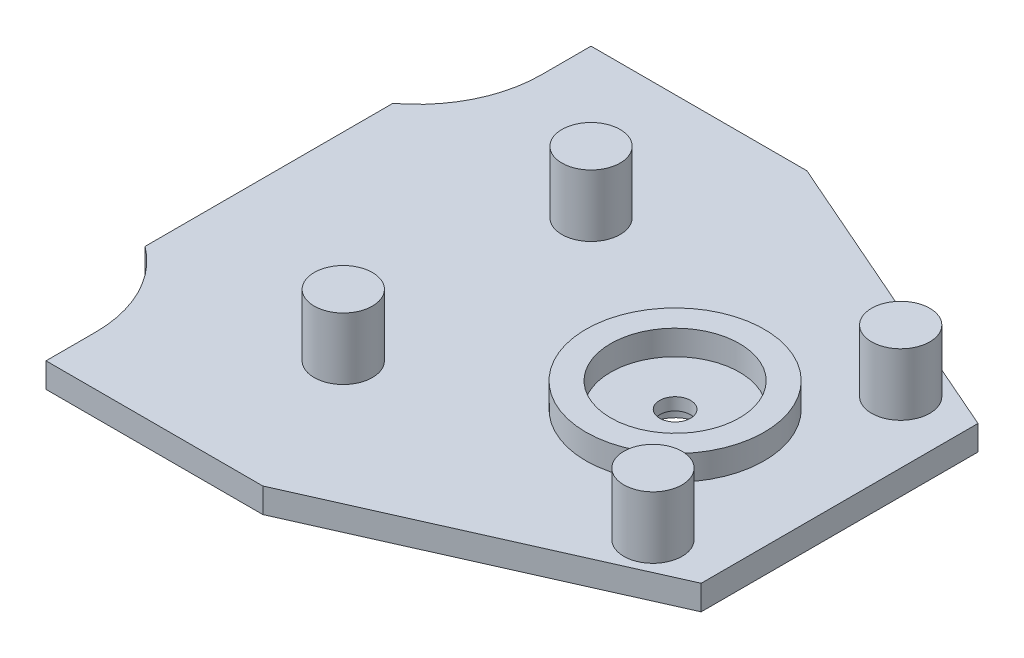
ISO-10303-21;
HEADER;
FILE_DESCRIPTION(('STEP AP214'),'2;1');
FILE_NAME('part.step','',(''),(''),'','','');
FILE_SCHEMA(('AUTOMOTIVE_DESIGN { 1 0 10303 214 1 1 1 1 }'));
ENDSEC;
DATA;
#1=APPLICATION_CONTEXT('core data for automotive mechanical design processes');
#2=APPLICATION_PROTOCOL_DEFINITION('international standard','automotive_design',2000,#1);
#3=PRODUCT_CONTEXT('',#1,'mechanical');
#4=PRODUCT('Part','Part','',(#3));
#5=PRODUCT_RELATED_PRODUCT_CATEGORY('part','',(#4));
#6=PRODUCT_DEFINITION_FORMATION('','',#4);
#7=PRODUCT_DEFINITION_CONTEXT('part definition',#1,'design');
#8=PRODUCT_DEFINITION('design','',#6,#7);
#9=PRODUCT_DEFINITION_SHAPE('','',#8);
#10=(LENGTH_UNIT() NAMED_UNIT(*) SI_UNIT(.MILLI.,.METRE.));
#11=(NAMED_UNIT(*) PLANE_ANGLE_UNIT() SI_UNIT($,.RADIAN.));
#12=(NAMED_UNIT(*) SI_UNIT($,.STERADIAN.) SOLID_ANGLE_UNIT());
#13=UNCERTAINTY_MEASURE_WITH_UNIT(LENGTH_MEASURE(1.E-05),#10,'distance_accuracy_value','');
#14=(GEOMETRIC_REPRESENTATION_CONTEXT(3) GLOBAL_UNCERTAINTY_ASSIGNED_CONTEXT((#13)) GLOBAL_UNIT_ASSIGNED_CONTEXT((#10,
#11,#12)) REPRESENTATION_CONTEXT('',''));
#15=CARTESIAN_POINT('',(0.,0.,0.));
#16=DIRECTION('',(0.,0.,1.));
#17=DIRECTION('',(1.,0.,0.));
#18=AXIS2_PLACEMENT_3D('',#15,#16,#17);
#19=CARTESIAN_POINT('',(11.5684631121391,2.,-2.08513458074343));
#20=DIRECTION('',(0.,-1.,0.));
#21=DIRECTION('',(0.,0.,-1.));
#22=AXIS2_PLACEMENT_3D('',#19,#20,#21);
#23=CYLINDRICAL_SURFACE('',#22,1.25);
#24=CARTESIAN_POINT('',(11.5684631121391,2.,-2.08513458074343));
#25=DIRECTION('',(0.,-1.,0.));
#26=DIRECTION('',(0.,0.,-1.));
#27=AXIS2_PLACEMENT_3D('',#24,#25,#26);
#28=CIRCLE('',#27,1.25);
#29=CARTESIAN_POINT('',(11.5684631121391,2.,-3.33513458074343));
#30=VERTEX_POINT('',#29);
#31=EDGE_CURVE('E496',#30,#30,#28,.T.);
#32=ORIENTED_EDGE('',*,*,#31,.F.);
#33=EDGE_LOOP('',(#32));
#34=FACE_BOUND('',#33,.T.);
#35=CARTESIAN_POINT('',(11.5684631121391,1.,-2.08513458074343));
#36=DIRECTION('',(0.,-1.,0.));
#37=DIRECTION('',(0.,0.,-1.));
#38=AXIS2_PLACEMENT_3D('',#35,#36,#37);
#39=CIRCLE('',#38,1.25);
#40=CARTESIAN_POINT('',(11.5684631121391,1.,-3.33513458074343));
#41=VERTEX_POINT('',#40);
#42=EDGE_CURVE('E41',#41,#41,#39,.F.);
#43=ORIENTED_EDGE('',*,*,#42,.F.);
#44=EDGE_LOOP('',(#43));
#45=FACE_BOUND('',#44,.T.);
#46=ADVANCED_FACE('F37',(#34,#45),#23,.F.);
#47=CARTESIAN_POINT('',(0.,2.,19.9148654192566));
#48=DIRECTION('',(0.,0.,-1.));
#49=DIRECTION('',(-1.,0.,0.));
#50=AXIS2_PLACEMENT_3D('',#47,#48,#49);
#51=PLANE('',#50);
#52=DIRECTION('',(1.,0.,0.));
#53=VECTOR('',#52,1.);
#54=CARTESIAN_POINT('',(0.,0.,19.9148654192566));
#55=LINE('',#54,#53);
#56=CARTESIAN_POINT('',(-17.2192882245591,0.,19.9148654192566));
#57=VERTEX_POINT('',#56);
#58=CARTESIAN_POINT('',(0.28632975296894,0.,19.9148654192566));
#59=VERTEX_POINT('',#58);
#60=EDGE_CURVE('E142',#57,#59,#55,.T.);
#61=ORIENTED_EDGE('',*,*,#60,.T.);
#62=DIRECTION('',(0.,-1.,0.));
#63=VECTOR('',#62,1.);
#64=CARTESIAN_POINT('',(0.28632975296894,2.,19.9148654192566));
#65=LINE('',#64,#63);
#66=CARTESIAN_POINT('',(0.28632975296894,2.,19.9148654192566));
#67=VERTEX_POINT('',#66);
#68=EDGE_CURVE('E122',#67,#59,#65,.T.);
#69=ORIENTED_EDGE('',*,*,#68,.F.);
#70=DIRECTION('',(1.,0.,0.));
#71=VECTOR('',#70,1.);
#72=CARTESIAN_POINT('',(0.,2.,19.9148654192566));
#73=LINE('',#72,#71);
#74=CARTESIAN_POINT('',(-17.2192882245591,2.,19.9148654192566));
#75=VERTEX_POINT('',#74);
#76=EDGE_CURVE('E129',#75,#67,#73,.T.);
#77=ORIENTED_EDGE('',*,*,#76,.F.);
#78=DIRECTION('',(0.,-1.,0.));
#79=VECTOR('',#78,1.);
#80=CARTESIAN_POINT('',(-17.2192882245591,2.,19.9148654192566));
#81=LINE('',#80,#79);
#82=EDGE_CURVE('E178',#75,#57,#81,.T.);
#83=ORIENTED_EDGE('',*,*,#82,.T.);
#84=EDGE_LOOP('',(#61,#69,#77,#83));
#85=FACE_BOUND('',#84,.T.);
#86=ADVANCED_FACE('F140',(#85),#51,.F.);
#87=CARTESIAN_POINT('',(7.44047295639382,2.,16.7338814208282));
#88=DIRECTION('',(-0.406284023423672,0.,-0.913746842572205));
#89=DIRECTION('',(-0.913746842572205,0.,0.406284023423672));
#90=AXIS2_PLACEMENT_3D('',#87,#88,#89);
#91=PLANE('',#90);
#92=DIRECTION('',(0.913746842572205,0.,-0.406284023423672));
#93=VECTOR('',#92,1.);
#94=CARTESIAN_POINT('',(7.44047295639382,0.,16.7338814208282));
#95=LINE('',#94,#93);
#96=CARTESIAN_POINT('',(24.780711775441,0.,9.02380061256203));
#97=VERTEX_POINT('',#96);
#98=EDGE_CURVE('E199',#59,#97,#95,.T.);
#99=ORIENTED_EDGE('',*,*,#98,.T.);
#100=DIRECTION('',(0.,-1.,0.));
#101=VECTOR('',#100,1.);
#102=CARTESIAN_POINT('',(24.780711775441,2.,9.02380061256203));
#103=LINE('',#102,#101);
#104=CARTESIAN_POINT('',(24.780711775441,2.,9.02380061256203));
#105=VERTEX_POINT('',#104);
#106=EDGE_CURVE('E124',#105,#97,#103,.T.);
#107=ORIENTED_EDGE('',*,*,#106,.F.);
#108=DIRECTION('',(0.913746842572205,0.,-0.406284023423672));
#109=VECTOR('',#108,1.);
#110=CARTESIAN_POINT('',(7.44047295639382,2.,16.7338814208282));
#111=LINE('',#110,#109);
#112=EDGE_CURVE('E117',#67,#105,#111,.T.);
#113=ORIENTED_EDGE('',*,*,#112,.F.);
#114=ORIENTED_EDGE('',*,*,#68,.T.);
#115=EDGE_LOOP('',(#99,#107,#113,#114));
#116=FACE_BOUND('',#115,.T.);
#117=ADVANCED_FACE('F120',(#116),#91,.F.);
#118=CARTESIAN_POINT('',(24.780711775441,2.,0.));
#119=DIRECTION('',(1.,0.,0.));
#120=DIRECTION('',(0.,0.,-1.));
#121=AXIS2_PLACEMENT_3D('',#118,#119,#120);
#122=PLANE('',#121);
#123=DIRECTION('',(0.,0.,1.));
#124=VECTOR('',#123,1.);
#125=CARTESIAN_POINT('',(24.780711775441,0.,0.));
#126=LINE('',#125,#124);
#127=CARTESIAN_POINT('',(24.780711775441,0.,-13.3261993874363));
#128=VERTEX_POINT('',#127);
#129=EDGE_CURVE('E195',#128,#97,#126,.T.);
#130=ORIENTED_EDGE('',*,*,#129,.F.);
#131=DIRECTION('',(0.,-1.,0.));
#132=VECTOR('',#131,1.);
#133=CARTESIAN_POINT('',(24.780711775441,2.,-13.3261993874363));
#134=LINE('',#133,#132);
#135=CARTESIAN_POINT('',(24.780711775441,2.,-13.3261993874363));
#136=VERTEX_POINT('',#135);
#137=EDGE_CURVE('E147',#136,#128,#134,.T.);
#138=ORIENTED_EDGE('',*,*,#137,.F.);
#139=DIRECTION('',(0.,0.,1.));
#140=VECTOR('',#139,1.);
#141=CARTESIAN_POINT('',(24.780711775441,2.,0.));
#142=LINE('',#141,#140);
#143=EDGE_CURVE('E128',#136,#105,#142,.T.);
#144=ORIENTED_EDGE('',*,*,#143,.T.);
#145=ORIENTED_EDGE('',*,*,#106,.T.);
#146=EDGE_LOOP('',(#130,#138,#144,#145));
#147=FACE_BOUND('',#146,.T.);
#148=ADVANCED_FACE('F198',(#147),#122,.T.);
#149=CARTESIAN_POINT('',(8.88303366933993,2.,-20.287214615769));
#150=DIRECTION('',(-0.401098407988486,0.,0.916034970461883));
#151=DIRECTION('',(0.916034970461883,0.,0.401098407988486));
#152=AXIS2_PLACEMENT_3D('',#149,#150,#151);
#153=PLANE('',#152);
#154=DIRECTION('',(-0.916034970461883,0.,-0.401098407988486));
#155=VECTOR('',#154,1.);
#156=CARTESIAN_POINT('',(8.88303366933993,0.,-20.287214615769));
#157=LINE('',#156,#155);
#158=CARTESIAN_POINT('',(0.209283204013273,0.,-24.0851345807434));
#159=VERTEX_POINT('',#158);
#160=EDGE_CURVE('E188',#128,#159,#157,.T.);
#161=ORIENTED_EDGE('',*,*,#160,.T.);
#162=DIRECTION('',(0.,-1.,0.));
#163=VECTOR('',#162,1.);
#164=CARTESIAN_POINT('',(0.209283204013273,2.,-24.0851345807434));
#165=LINE('',#164,#163);
#166=CARTESIAN_POINT('',(0.209283204013273,2.,-24.0851345807434));
#167=VERTEX_POINT('',#166);
#168=EDGE_CURVE('E176',#167,#159,#165,.T.);
#169=ORIENTED_EDGE('',*,*,#168,.F.);
#170=DIRECTION('',(-0.916034970461883,0.,-0.401098407988486));
#171=VECTOR('',#170,1.);
#172=CARTESIAN_POINT('',(8.88303366933993,2.,-20.287214615769));
#173=LINE('',#172,#171);
#174=EDGE_CURVE('E189',#136,#167,#173,.T.);
#175=ORIENTED_EDGE('',*,*,#174,.F.);
#176=ORIENTED_EDGE('',*,*,#137,.T.);
#177=EDGE_LOOP('',(#161,#169,#175,#176));
#178=FACE_BOUND('',#177,.T.);
#179=ADVANCED_FACE('F186',(#178),#153,.F.);
#180=CARTESIAN_POINT('',(0.,2.,-24.0851345807434));
#181=DIRECTION('',(0.,0.,1.));
#182=DIRECTION('',(1.,0.,0.));
#183=AXIS2_PLACEMENT_3D('',#180,#181,#182);
#184=PLANE('',#183);
#185=DIRECTION('',(-1.,0.,0.));
#186=VECTOR('',#185,1.);
#187=CARTESIAN_POINT('',(0.,0.,-24.0851345807434));
#188=LINE('',#187,#186);
#189=CARTESIAN_POINT('',(-17.219288224559,0.,-24.0851345807435));
#190=VERTEX_POINT('',#189);
#191=EDGE_CURVE('E196',#159,#190,#188,.T.);
#192=ORIENTED_EDGE('',*,*,#191,.T.);
#193=DIRECTION('',(0.,-1.,0.));
#194=VECTOR('',#193,1.);
#195=CARTESIAN_POINT('',(-17.219288224559,2.,-24.0851345807435));
#196=LINE('',#195,#194);
#197=CARTESIAN_POINT('',(-17.219288224559,2.,-24.0851345807435));
#198=VERTEX_POINT('',#197);
#199=EDGE_CURVE('E173',#198,#190,#196,.T.);
#200=ORIENTED_EDGE('',*,*,#199,.F.);
#201=DIRECTION('',(-1.,0.,0.));
#202=VECTOR('',#201,1.);
#203=CARTESIAN_POINT('',(0.,2.,-24.0851345807434));
#204=LINE('',#203,#202);
#205=EDGE_CURVE('E225',#167,#198,#204,.T.);
#206=ORIENTED_EDGE('',*,*,#205,.F.);
#207=ORIENTED_EDGE('',*,*,#168,.T.);
#208=EDGE_LOOP('',(#192,#200,#206,#207));
#209=FACE_BOUND('',#208,.T.);
#210=ADVANCED_FACE('F229',(#209),#184,.F.);
#211=CARTESIAN_POINT('',(-17.2192882245591,2.,0.));
#212=DIRECTION('',(1.,0.,0.));
#213=DIRECTION('',(0.,0.,-1.));
#214=AXIS2_PLACEMENT_3D('',#211,#212,#213);
#215=PLANE('',#214);
#216=DIRECTION('',(0.,0.,1.));
#217=VECTOR('',#216,1.);
#218=CARTESIAN_POINT('',(-17.2192882245591,0.,0.));
#219=LINE('',#218,#217);
#220=CARTESIAN_POINT('',(-17.219288224559,0.,-20.0851345807434));
#221=VERTEX_POINT('',#220);
#222=EDGE_CURVE('E205',#190,#221,#219,.T.);
#223=ORIENTED_EDGE('',*,*,#222,.T.);
#224=DIRECTION('',(0.,1.,0.));
#225=VECTOR('',#224,1.);
#226=CARTESIAN_POINT('',(-17.219288224559,2.,-20.0851345807434));
#227=LINE('',#226,#225);
#228=CARTESIAN_POINT('',(-17.219288224559,2.,-20.0851345807434));
#229=VERTEX_POINT('',#228);
#230=EDGE_CURVE('E53',#221,#229,#227,.T.);
#231=ORIENTED_EDGE('',*,*,#230,.T.);
#232=DIRECTION('',(0.,0.,1.));
#233=VECTOR('',#232,1.);
#234=CARTESIAN_POINT('',(-17.2192882245591,2.,0.));
#235=LINE('',#234,#233);
#236=EDGE_CURVE('E161',#198,#229,#235,.T.);
#237=ORIENTED_EDGE('',*,*,#236,.F.);
#238=ORIENTED_EDGE('',*,*,#199,.T.);
#239=EDGE_LOOP('',(#223,#231,#237,#238));
#240=FACE_BOUND('',#239,.T.);
#241=ADVANCED_FACE('F230',(#240),#215,.F.);
#242=CARTESIAN_POINT('',(-21.219288224559,2.,0.));
#243=DIRECTION('',(1.,0.,0.));
#244=DIRECTION('',(0.,0.,-1.));
#245=AXIS2_PLACEMENT_3D('',#242,#243,#244);
#246=PLANE('',#245);
#247=DIRECTION('',(0.,0.,1.));
#248=VECTOR('',#247,1.);
#249=CARTESIAN_POINT('',(-21.219288224559,0.,0.));
#250=LINE('',#249,#248);
#251=CARTESIAN_POINT('',(-21.219288224559,0.,-12.0851345807434));
#252=VERTEX_POINT('',#251);
#253=CARTESIAN_POINT('',(-21.2192882245591,0.,7.91486541925655));
#254=VERTEX_POINT('',#253);
#255=EDGE_CURVE('E207',#252,#254,#250,.T.);
#256=ORIENTED_EDGE('',*,*,#255,.T.);
#257=DIRECTION('',(0.,-1.,0.));
#258=VECTOR('',#257,1.);
#259=CARTESIAN_POINT('',(-21.2192882245591,2.,7.91486541925655));
#260=LINE('',#259,#258);
#261=CARTESIAN_POINT('',(-21.2192882245591,2.,7.91486541925655));
#262=VERTEX_POINT('',#261);
#263=EDGE_CURVE('E170',#262,#254,#260,.T.);
#264=ORIENTED_EDGE('',*,*,#263,.F.);
#265=DIRECTION('',(0.,0.,1.));
#266=VECTOR('',#265,1.);
#267=CARTESIAN_POINT('',(-21.219288224559,2.,0.));
#268=LINE('',#267,#266);
#269=CARTESIAN_POINT('',(-21.219288224559,2.,-12.0851345807434));
#270=VERTEX_POINT('',#269);
#271=EDGE_CURVE('E159',#270,#262,#268,.T.);
#272=ORIENTED_EDGE('',*,*,#271,.F.);
#273=DIRECTION('',(0.,-1.,0.));
#274=VECTOR('',#273,1.);
#275=CARTESIAN_POINT('',(-21.219288224559,2.,-12.0851345807434));
#276=LINE('',#275,#274);
#277=EDGE_CURVE('E168',#270,#252,#276,.T.);
#278=ORIENTED_EDGE('',*,*,#277,.T.);
#279=EDGE_LOOP('',(#256,#264,#272,#278));
#280=FACE_BOUND('',#279,.T.);
#281=ADVANCED_FACE('F167',(#280),#246,.F.);
#282=CARTESIAN_POINT('',(-17.219288224559,2.,0.));
#283=DIRECTION('',(1.,0.,0.));
#284=DIRECTION('',(0.,0.,-1.));
#285=AXIS2_PLACEMENT_3D('',#282,#283,#284);
#286=PLANE('',#285);
#287=DIRECTION('',(0.,0.,1.));
#288=VECTOR('',#287,1.);
#289=CARTESIAN_POINT('',(-17.219288224559,2.,0.));
#290=LINE('',#289,#288);
#291=CARTESIAN_POINT('',(-17.2192882245591,2.,15.9148654192566));
#292=VERTEX_POINT('',#291);
#293=EDGE_CURVE('E134',#292,#75,#290,.T.);
#294=ORIENTED_EDGE('',*,*,#293,.F.);
#295=DIRECTION('',(0.,-1.,0.));
#296=VECTOR('',#295,1.);
#297=CARTESIAN_POINT('',(-17.2192882245591,2.,15.9148654192566));
#298=LINE('',#297,#296);
#299=CARTESIAN_POINT('',(-17.2192882245591,0.,15.9148654192566));
#300=VERTEX_POINT('',#299);
#301=EDGE_CURVE('E143',#292,#300,#298,.T.);
#302=ORIENTED_EDGE('',*,*,#301,.T.);
#303=DIRECTION('',(0.,0.,1.));
#304=VECTOR('',#303,1.);
#305=CARTESIAN_POINT('',(-17.219288224559,0.,0.));
#306=LINE('',#305,#304);
#307=EDGE_CURVE('E138',#300,#57,#306,.T.);
#308=ORIENTED_EDGE('',*,*,#307,.T.);
#309=ORIENTED_EDGE('',*,*,#82,.F.);
#310=EDGE_LOOP('',(#294,#302,#308,#309));
#311=FACE_BOUND('',#310,.T.);
#312=ADVANCED_FACE('F237',(#311),#286,.F.);
#313=CARTESIAN_POINT('',(0.,2.,0.));
#314=DIRECTION('',(0.,1.,0.));
#315=DIRECTION('',(0.,0.,1.));
#316=AXIS2_PLACEMENT_3D('',#313,#314,#315);
#317=PLANE('',#316);
#318=CARTESIAN_POINT('',(-5.21928822455917,2.,-12.0851345807436));
#319=DIRECTION('',(0.,1.,0.));
#320=DIRECTION('',(0.,0.,1.));
#321=AXIS2_PLACEMENT_3D('',#318,#319,#320);
#322=CIRCLE('',#321,2.35);
#323=CARTESIAN_POINT('',(-5.21928822455917,2.,-9.73513458074358));
#324=VERTEX_POINT('',#323);
#325=EDGE_CURVE('E469',#324,#324,#322,.T.);
#326=ORIENTED_EDGE('',*,*,#325,.F.);
#327=EDGE_LOOP('',(#326));
#328=FACE_BOUND('',#327,.T.);
#329=CARTESIAN_POINT('',(-5.21928822455906,2.,7.91486541925656));
#330=DIRECTION('',(0.,1.,0.));
#331=DIRECTION('',(0.,0.,1.));
#332=AXIS2_PLACEMENT_3D('',#329,#330,#331);
#333=CIRCLE('',#332,2.35);
#334=CARTESIAN_POINT('',(-5.21928822455906,2.,10.2648654192566));
#335=VERTEX_POINT('',#334);
#336=EDGE_CURVE('E468',#335,#335,#333,.T.);
#337=ORIENTED_EDGE('',*,*,#336,.F.);
#338=EDGE_LOOP('',(#337));
#339=FACE_BOUND('',#338,.T.);
#340=CARTESIAN_POINT('',(19.7807117754409,2.,-12.0851345807433));
#341=DIRECTION('',(0.,1.,0.));
#342=DIRECTION('',(0.,0.,1.));
#343=AXIS2_PLACEMENT_3D('',#340,#341,#342);
#344=CIRCLE('',#343,2.35000000000005);
#345=CARTESIAN_POINT('',(19.7807117754409,2.,-9.73513458074326));
#346=VERTEX_POINT('',#345);
#347=EDGE_CURVE('E478',#346,#346,#344,.T.);
#348=ORIENTED_EDGE('',*,*,#347,.F.);
#349=EDGE_LOOP('',(#348));
#350=FACE_BOUND('',#349,.T.);
#351=CARTESIAN_POINT('',(19.7807117754415,2.,7.91486541925547));
#352=DIRECTION('',(0.,1.,0.));
#353=DIRECTION('',(0.,0.,1.));
#354=AXIS2_PLACEMENT_3D('',#351,#352,#353);
#355=CIRCLE('',#354,2.34999999999959);
#356=CARTESIAN_POINT('',(19.7807117754415,2.,10.2648654192551));
#357=VERTEX_POINT('',#356);
#358=EDGE_CURVE('E483',#357,#357,#355,.T.);
#359=ORIENTED_EDGE('',*,*,#358,.F.);
#360=EDGE_LOOP('',(#359));
#361=FACE_BOUND('',#360,.T.);
#362=CARTESIAN_POINT('',(11.5684631121391,2.,-2.08513458074343));
#363=DIRECTION('',(0.,1.,0.));
#364=DIRECTION('',(0.,0.,1.));
#365=AXIS2_PLACEMENT_3D('',#362,#363,#364);
#366=CIRCLE('',#365,7.2);
#367=CARTESIAN_POINT('',(11.5684631121391,2.,5.11486541925656));
#368=VERTEX_POINT('',#367);
#369=EDGE_CURVE('E213',#368,#368,#366,.T.);
#370=ORIENTED_EDGE('',*,*,#369,.F.);
#371=EDGE_LOOP('',(#370));
#372=FACE_BOUND('',#371,.T.);
#373=ORIENTED_EDGE('',*,*,#76,.T.);
#374=ORIENTED_EDGE('',*,*,#112,.T.);
#375=ORIENTED_EDGE('',*,*,#143,.F.);
#376=ORIENTED_EDGE('',*,*,#174,.T.);
#377=ORIENTED_EDGE('',*,*,#205,.T.);
#378=ORIENTED_EDGE('',*,*,#236,.T.);
#379=CARTESIAN_POINT('',(-27.219288224559,2.,-20.0851345807434));
#380=DIRECTION('',(0.,1.,0.));
#381=DIRECTION('',(0.,0.,1.));
#382=AXIS2_PLACEMENT_3D('',#379,#380,#381);
#383=CIRCLE('',#382,10.);
#384=EDGE_CURVE('E46',#229,#270,#383,.F.);
#385=ORIENTED_EDGE('',*,*,#384,.T.);
#386=ORIENTED_EDGE('',*,*,#271,.T.);
#387=CARTESIAN_POINT('',(-27.2192882245591,2.,15.9148654192565));
#388=DIRECTION('',(0.,1.,0.));
#389=DIRECTION('',(0.,0.,1.));
#390=AXIS2_PLACEMENT_3D('',#387,#388,#389);
#391=CIRCLE('',#390,10.);
#392=EDGE_CURVE('E154',#262,#292,#391,.F.);
#393=ORIENTED_EDGE('',*,*,#392,.T.);
#394=ORIENTED_EDGE('',*,*,#293,.T.);
#395=EDGE_LOOP('',(#373,#374,#375,#376,#377,#378,#385,#386,#393,#394));
#396=FACE_BOUND('',#395,.T.);
#397=ADVANCED_FACE('F132',(#328,#339,#350,#361,#372,#396),#317,.T.);
#398=CARTESIAN_POINT('',(0.,0.,0.));
#399=DIRECTION('',(0.,1.,0.));
#400=DIRECTION('',(0.,0.,1.));
#401=AXIS2_PLACEMENT_3D('',#398,#399,#400);
#402=PLANE('',#401);
#403=CARTESIAN_POINT('',(11.5684631121391,0.,-2.08513458074343));
#404=DIRECTION('',(0.,-1.,0.));
#405=DIRECTION('',(0.,0.,-1.));
#406=AXIS2_PLACEMENT_3D('',#403,#404,#405);
#407=CIRCLE('',#406,2.);
#408=CARTESIAN_POINT('',(11.5684631121391,0.,-4.08513458074343));
#409=VERTEX_POINT('',#408);
#410=EDGE_CURVE('E489',#409,#409,#407,.T.);
#411=ORIENTED_EDGE('',*,*,#410,.F.);
#412=EDGE_LOOP('',(#411));
#413=FACE_BOUND('',#412,.T.);
#414=ORIENTED_EDGE('',*,*,#60,.F.);
#415=ORIENTED_EDGE('',*,*,#307,.F.);
#416=CARTESIAN_POINT('',(-27.2192882245591,0.,15.9148654192565));
#417=DIRECTION('',(0.,1.,0.));
#418=DIRECTION('',(0.,0.,1.));
#419=AXIS2_PLACEMENT_3D('',#416,#417,#418);
#420=CIRCLE('',#419,10.);
#421=EDGE_CURVE('E152',#300,#254,#420,.T.);
#422=ORIENTED_EDGE('',*,*,#421,.T.);
#423=ORIENTED_EDGE('',*,*,#255,.F.);
#424=CARTESIAN_POINT('',(-27.219288224559,0.,-20.0851345807434));
#425=DIRECTION('',(0.,1.,0.));
#426=DIRECTION('',(0.,0.,1.));
#427=AXIS2_PLACEMENT_3D('',#424,#425,#426);
#428=CIRCLE('',#427,10.);
#429=EDGE_CURVE('E61',#252,#221,#428,.T.);
#430=ORIENTED_EDGE('',*,*,#429,.T.);
#431=ORIENTED_EDGE('',*,*,#222,.F.);
#432=ORIENTED_EDGE('',*,*,#191,.F.);
#433=ORIENTED_EDGE('',*,*,#160,.F.);
#434=ORIENTED_EDGE('',*,*,#129,.T.);
#435=ORIENTED_EDGE('',*,*,#98,.F.);
#436=EDGE_LOOP('',(#414,#415,#422,#423,#430,#431,#432,#433,#434,#435));
#437=FACE_BOUND('',#436,.T.);
#438=ADVANCED_FACE('F194',(#413,#437),#402,.F.);
#439=CARTESIAN_POINT('',(-27.2192882245591,2.,15.9148654192565));
#440=DIRECTION('',(0.,-1.,0.));
#441=DIRECTION('',(0.,0.,-1.));
#442=AXIS2_PLACEMENT_3D('',#439,#440,#441);
#443=CYLINDRICAL_SURFACE('',#442,10.);
#444=ORIENTED_EDGE('',*,*,#392,.F.);
#445=ORIENTED_EDGE('',*,*,#263,.T.);
#446=ORIENTED_EDGE('',*,*,#421,.F.);
#447=ORIENTED_EDGE('',*,*,#301,.F.);
#448=EDGE_LOOP('',(#444,#445,#446,#447));
#449=FACE_BOUND('',#448,.T.);
#450=ADVANCED_FACE('F270',(#449),#443,.F.);
#451=CARTESIAN_POINT('',(-27.219288224559,2.,-20.0851345807434));
#452=DIRECTION('',(0.,1.,0.));
#453=DIRECTION('',(0.,0.,1.));
#454=AXIS2_PLACEMENT_3D('',#451,#452,#453);
#455=CYLINDRICAL_SURFACE('',#454,10.);
#456=ORIENTED_EDGE('',*,*,#384,.F.);
#457=ORIENTED_EDGE('',*,*,#230,.F.);
#458=ORIENTED_EDGE('',*,*,#429,.F.);
#459=ORIENTED_EDGE('',*,*,#277,.F.);
#460=EDGE_LOOP('',(#456,#457,#458,#459));
#461=FACE_BOUND('',#460,.T.);
#462=ADVANCED_FACE('F39',(#461),#455,.F.);
#463=CARTESIAN_POINT('',(11.5684631121391,4.,-2.08513458074343));
#464=DIRECTION('',(0.,1.,0.));
#465=DIRECTION('',(0.,0.,1.));
#466=AXIS2_PLACEMENT_3D('',#463,#464,#465);
#467=PLANE('',#466);
#468=CARTESIAN_POINT('',(11.5684631121391,4.,-2.08513458074343));
#469=DIRECTION('',(0.,1.,0.));
#470=DIRECTION('',(0.,0.,1.));
#471=AXIS2_PLACEMENT_3D('',#468,#469,#470);
#472=CIRCLE('',#471,7.2);
#473=CARTESIAN_POINT('',(11.5684631121391,4.,5.11486541925656));
#474=VERTEX_POINT('',#473);
#475=EDGE_CURVE('E211',#474,#474,#472,.T.);
#476=ORIENTED_EDGE('',*,*,#475,.T.);
#477=EDGE_LOOP('',(#476));
#478=FACE_BOUND('',#477,.T.);
#479=CARTESIAN_POINT('',(11.5684631121391,4.,-2.08513458074343));
#480=DIRECTION('',(0.,1.,0.));
#481=DIRECTION('',(0.,0.,1.));
#482=AXIS2_PLACEMENT_3D('',#479,#480,#481);
#483=CIRCLE('',#482,5.2);
#484=CARTESIAN_POINT('',(11.5684631121391,4.,3.11486541925657));
#485=VERTEX_POINT('',#484);
#486=EDGE_CURVE('E218',#485,#485,#483,.T.);
#487=ORIENTED_EDGE('',*,*,#486,.F.);
#488=EDGE_LOOP('',(#487));
#489=FACE_BOUND('',#488,.T.);
#490=ADVANCED_FACE('F259',(#478,#489),#467,.T.);
#491=CARTESIAN_POINT('',(11.5684631121391,4.,-2.08513458074343));
#492=DIRECTION('',(0.,-1.,0.));
#493=DIRECTION('',(0.,0.,-1.));
#494=AXIS2_PLACEMENT_3D('',#491,#492,#493);
#495=CYLINDRICAL_SURFACE('',#494,7.2);
#496=ORIENTED_EDGE('',*,*,#475,.F.);
#497=EDGE_LOOP('',(#496));
#498=FACE_BOUND('',#497,.T.);
#499=ORIENTED_EDGE('',*,*,#369,.T.);
#500=EDGE_LOOP('',(#499));
#501=FACE_BOUND('',#500,.T.);
#502=ADVANCED_FACE('F257',(#498,#501),#495,.T.);
#503=CARTESIAN_POINT('',(11.5684631121391,4.,-2.08513458074343));
#504=DIRECTION('',(0.,-1.,0.));
#505=DIRECTION('',(0.,0.,-1.));
#506=AXIS2_PLACEMENT_3D('',#503,#504,#505);
#507=CYLINDRICAL_SURFACE('',#506,5.2);
#508=ORIENTED_EDGE('',*,*,#486,.T.);
#509=EDGE_LOOP('',(#508));
#510=FACE_BOUND('',#509,.T.);
#511=CARTESIAN_POINT('',(11.5684631121391,2.,-2.08513458074343));
#512=DIRECTION('',(0.,1.,0.));
#513=DIRECTION('',(0.,0.,1.));
#514=AXIS2_PLACEMENT_3D('',#511,#512,#513);
#515=CIRCLE('',#514,5.2);
#516=CARTESIAN_POINT('',(11.5684631121391,2.,3.11486541925657));
#517=VERTEX_POINT('',#516);
#518=EDGE_CURVE('E11',#517,#517,#515,.F.);
#519=ORIENTED_EDGE('',*,*,#518,.T.);
#520=EDGE_LOOP('',(#519));
#521=FACE_BOUND('',#520,.T.);
#522=ADVANCED_FACE('F253',(#510,#521),#507,.F.);
#523=ORIENTED_EDGE('',*,*,#31,.T.);
#524=EDGE_LOOP('',(#523));
#525=FACE_BOUND('',#524,.T.);
#526=ORIENTED_EDGE('',*,*,#518,.F.);
#527=EDGE_LOOP('',(#526));
#528=FACE_BOUND('',#527,.T.);
#529=ADVANCED_FACE('F256',(#525,#528),#317,.T.);
#530=CARTESIAN_POINT('',(11.5684631121391,1.,-2.08513458074343));
#531=DIRECTION('',(0.,-1.,0.));
#532=DIRECTION('',(0.,0.,-1.));
#533=AXIS2_PLACEMENT_3D('',#530,#531,#532);
#534=PLANE('',#533);
#535=CARTESIAN_POINT('',(11.5684631121391,1.,-2.08513458074343));
#536=DIRECTION('',(0.,-1.,0.));
#537=DIRECTION('',(0.,0.,-1.));
#538=AXIS2_PLACEMENT_3D('',#535,#536,#537);
#539=CIRCLE('',#538,2.);
#540=CARTESIAN_POINT('',(11.5684631121391,1.,-4.08513458074343));
#541=VERTEX_POINT('',#540);
#542=EDGE_CURVE('E492',#541,#541,#539,.T.);
#543=ORIENTED_EDGE('',*,*,#542,.T.);
#544=EDGE_LOOP('',(#543));
#545=FACE_BOUND('',#544,.T.);
#546=ORIENTED_EDGE('',*,*,#42,.T.);
#547=EDGE_LOOP('',(#546));
#548=FACE_BOUND('',#547,.T.);
#549=ADVANCED_FACE('F351',(#545,#548),#534,.T.);
#550=CARTESIAN_POINT('',(11.5684631121391,1.,-2.08513458074343));
#551=DIRECTION('',(0.,-1.,0.));
#552=DIRECTION('',(0.,0.,-1.));
#553=AXIS2_PLACEMENT_3D('',#550,#551,#552);
#554=CYLINDRICAL_SURFACE('',#553,2.);
#555=ORIENTED_EDGE('',*,*,#542,.F.);
#556=EDGE_LOOP('',(#555));
#557=FACE_BOUND('',#556,.T.);
#558=ORIENTED_EDGE('',*,*,#410,.T.);
#559=EDGE_LOOP('',(#558));
#560=FACE_BOUND('',#559,.T.);
#561=ADVANCED_FACE('F251',(#557,#560),#554,.F.);
#562=CARTESIAN_POINT('',(19.7807117754415,7.,7.91486541925547));
#563=DIRECTION('',(0.,-1.,0.));
#564=DIRECTION('',(0.,0.,-1.));
#565=AXIS2_PLACEMENT_3D('',#562,#563,#564);
#566=CYLINDRICAL_SURFACE('',#565,2.34999999999959);
#567=CARTESIAN_POINT('',(19.7807117754415,7.,7.91486541925547));
#568=DIRECTION('',(0.,1.,0.));
#569=DIRECTION('',(0.,0.,1.));
#570=AXIS2_PLACEMENT_3D('',#567,#568,#569);
#571=CIRCLE('',#570,2.34999999999959);
#572=CARTESIAN_POINT('',(19.7807117754415,7.,10.2648654192551));
#573=VERTEX_POINT('',#572);
#574=EDGE_CURVE('E486',#573,#573,#571,.T.);
#575=ORIENTED_EDGE('',*,*,#574,.F.);
#576=EDGE_LOOP('',(#575));
#577=FACE_BOUND('',#576,.T.);
#578=ORIENTED_EDGE('',*,*,#358,.T.);
#579=EDGE_LOOP('',(#578));
#580=FACE_BOUND('',#579,.T.);
#581=ADVANCED_FACE('F377',(#577,#580),#566,.T.);
#582=CARTESIAN_POINT('',(19.7807117754415,7.,7.91486541925547));
#583=DIRECTION('',(0.,1.,0.));
#584=DIRECTION('',(0.,0.,1.));
#585=AXIS2_PLACEMENT_3D('',#582,#583,#584);
#586=PLANE('',#585);
#587=ORIENTED_EDGE('',*,*,#574,.T.);
#588=EDGE_LOOP('',(#587));
#589=FACE_BOUND('',#588,.T.);
#590=ADVANCED_FACE('F391',(#589),#586,.T.);
#591=CARTESIAN_POINT('',(19.7807117754409,7.,-12.0851345807433));
#592=DIRECTION('',(0.,-1.,0.));
#593=DIRECTION('',(0.,0.,-1.));
#594=AXIS2_PLACEMENT_3D('',#591,#592,#593);
#595=CYLINDRICAL_SURFACE('',#594,2.35000000000005);
#596=CARTESIAN_POINT('',(19.7807117754409,7.,-12.0851345807433));
#597=DIRECTION('',(0.,1.,0.));
#598=DIRECTION('',(0.,0.,1.));
#599=AXIS2_PLACEMENT_3D('',#596,#597,#598);
#600=CIRCLE('',#599,2.35000000000005);
#601=CARTESIAN_POINT('',(19.7807117754409,7.,-9.73513458074326));
#602=VERTEX_POINT('',#601);
#603=EDGE_CURVE('E480',#602,#602,#600,.T.);
#604=ORIENTED_EDGE('',*,*,#603,.F.);
#605=EDGE_LOOP('',(#604));
#606=FACE_BOUND('',#605,.T.);
#607=ORIENTED_EDGE('',*,*,#347,.T.);
#608=EDGE_LOOP('',(#607));
#609=FACE_BOUND('',#608,.T.);
#610=ADVANCED_FACE('F401',(#606,#609),#595,.T.);
#611=CARTESIAN_POINT('',(19.7807117754409,7.,-12.0851345807433));
#612=DIRECTION('',(0.,1.,0.));
#613=DIRECTION('',(0.,0.,1.));
#614=AXIS2_PLACEMENT_3D('',#611,#612,#613);
#615=PLANE('',#614);
#616=ORIENTED_EDGE('',*,*,#603,.T.);
#617=EDGE_LOOP('',(#616));
#618=FACE_BOUND('',#617,.T.);
#619=ADVANCED_FACE('F411',(#618),#615,.T.);
#620=CARTESIAN_POINT('',(-5.21928822455906,7.,7.91486541925656));
#621=DIRECTION('',(0.,-1.,0.));
#622=DIRECTION('',(0.,0.,-1.));
#623=AXIS2_PLACEMENT_3D('',#620,#621,#622);
#624=CYLINDRICAL_SURFACE('',#623,2.35);
#625=CARTESIAN_POINT('',(-5.21928822455906,7.,7.91486541925656));
#626=DIRECTION('',(0.,1.,0.));
#627=DIRECTION('',(0.,0.,1.));
#628=AXIS2_PLACEMENT_3D('',#625,#626,#627);
#629=CIRCLE('',#628,2.35);
#630=CARTESIAN_POINT('',(-5.21928822455906,7.,10.2648654192566));
#631=VERTEX_POINT('',#630);
#632=EDGE_CURVE('E472',#631,#631,#629,.T.);
#633=ORIENTED_EDGE('',*,*,#632,.F.);
#634=EDGE_LOOP('',(#633));
#635=FACE_BOUND('',#634,.T.);
#636=ORIENTED_EDGE('',*,*,#336,.T.);
#637=EDGE_LOOP('',(#636));
#638=FACE_BOUND('',#637,.T.);
#639=ADVANCED_FACE('F421',(#635,#638),#624,.T.);
#640=CARTESIAN_POINT('',(-5.21928822455906,7.,7.91486541925656));
#641=DIRECTION('',(0.,1.,0.));
#642=DIRECTION('',(0.,0.,1.));
#643=AXIS2_PLACEMENT_3D('',#640,#641,#642);
#644=PLANE('',#643);
#645=ORIENTED_EDGE('',*,*,#632,.T.);
#646=EDGE_LOOP('',(#645));
#647=FACE_BOUND('',#646,.T.);
#648=ADVANCED_FACE('F431',(#647),#644,.T.);
#649=CARTESIAN_POINT('',(-5.21928822455917,7.,-12.0851345807436));
#650=DIRECTION('',(0.,-1.,0.));
#651=DIRECTION('',(0.,0.,-1.));
#652=AXIS2_PLACEMENT_3D('',#649,#650,#651);
#653=CYLINDRICAL_SURFACE('',#652,2.35);
#654=CARTESIAN_POINT('',(-5.21928822455917,7.,-12.0851345807436));
#655=DIRECTION('',(0.,1.,0.));
#656=DIRECTION('',(0.,0.,1.));
#657=AXIS2_PLACEMENT_3D('',#654,#655,#656);
#658=CIRCLE('',#657,2.35);
#659=CARTESIAN_POINT('',(-5.21928822455917,7.,-9.73513458074358));
#660=VERTEX_POINT('',#659);
#661=EDGE_CURVE('E467',#660,#660,#658,.T.);
#662=ORIENTED_EDGE('',*,*,#661,.F.);
#663=EDGE_LOOP('',(#662));
#664=FACE_BOUND('',#663,.T.);
#665=ORIENTED_EDGE('',*,*,#325,.T.);
#666=EDGE_LOOP('',(#665));
#667=FACE_BOUND('',#666,.T.);
#668=ADVANCED_FACE('F441',(#664,#667),#653,.T.);
#669=CARTESIAN_POINT('',(-5.21928822455917,7.,-12.0851345807436));
#670=DIRECTION('',(0.,1.,0.));
#671=DIRECTION('',(0.,0.,1.));
#672=AXIS2_PLACEMENT_3D('',#669,#670,#671);
#673=PLANE('',#672);
#674=ORIENTED_EDGE('',*,*,#661,.T.);
#675=EDGE_LOOP('',(#674));
#676=FACE_BOUND('',#675,.T.);
#677=ADVANCED_FACE('F451',(#676),#673,.T.);
#678=CLOSED_SHELL('',(#46,#86,#117,#148,#179,#210,#241,#281,#312,#397,#438,#450,#462,#490,#502,
#522,#529,#549,#561,#581,#590,#610,#619,#639,#648,#668,#677));
#679=MANIFOLD_SOLID_BREP('B2',#678);
#680=ADVANCED_BREP_SHAPE_REPRESENTATION('',(#18,#679),#14);
#681=SHAPE_DEFINITION_REPRESENTATION(#9,#680);
ENDSEC;
END-ISO-10303-21;
